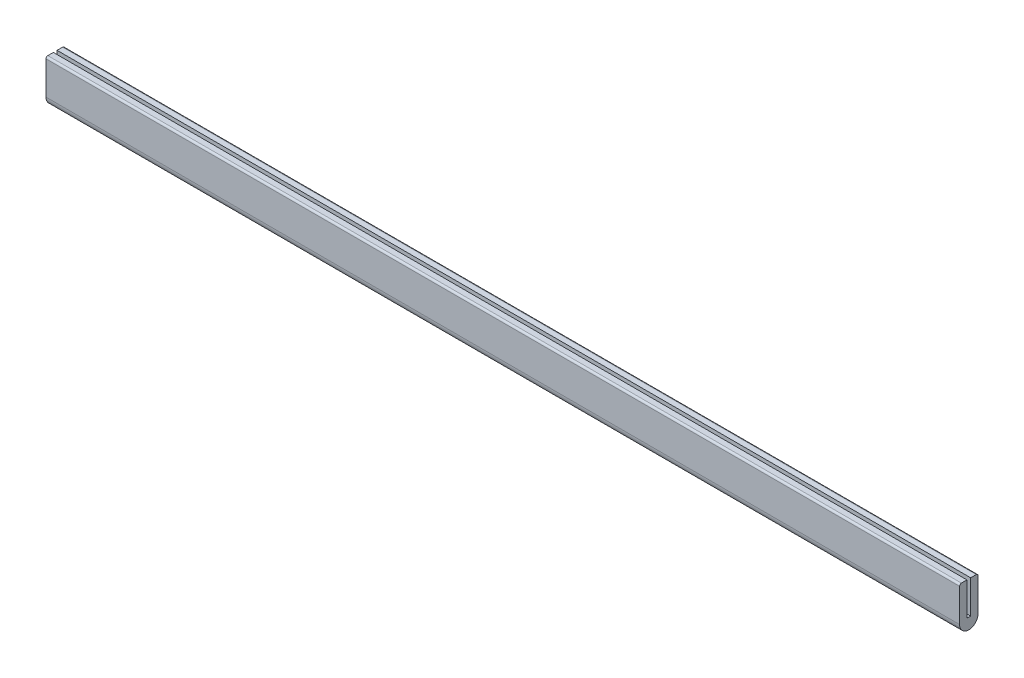
ISO-10303-21;
HEADER;
FILE_DESCRIPTION(('STEP AP214'),'2;1');
FILE_NAME('part.step','',(''),(''),'','','');
FILE_SCHEMA(('AUTOMOTIVE_DESIGN { 1 0 10303 214 1 1 1 1 }'));
ENDSEC;
DATA;
#1=APPLICATION_CONTEXT('core data for automotive mechanical design processes');
#2=APPLICATION_PROTOCOL_DEFINITION('international standard','automotive_design',2000,#1);
#3=PRODUCT_CONTEXT('',#1,'mechanical');
#4=PRODUCT('Part','Part','',(#3));
#5=PRODUCT_RELATED_PRODUCT_CATEGORY('part','',(#4));
#6=PRODUCT_DEFINITION_FORMATION('','',#4);
#7=PRODUCT_DEFINITION_CONTEXT('part definition',#1,'design');
#8=PRODUCT_DEFINITION('design','',#6,#7);
#9=PRODUCT_DEFINITION_SHAPE('','',#8);
#10=(LENGTH_UNIT() NAMED_UNIT(*) SI_UNIT(.MILLI.,.METRE.));
#11=(NAMED_UNIT(*) PLANE_ANGLE_UNIT() SI_UNIT($,.RADIAN.));
#12=(NAMED_UNIT(*) SI_UNIT($,.STERADIAN.) SOLID_ANGLE_UNIT());
#13=UNCERTAINTY_MEASURE_WITH_UNIT(LENGTH_MEASURE(1.E-05),#10,'distance_accuracy_value','');
#14=(GEOMETRIC_REPRESENTATION_CONTEXT(3) GLOBAL_UNCERTAINTY_ASSIGNED_CONTEXT((#13)) GLOBAL_UNIT_ASSIGNED_CONTEXT((#10,
#11,#12)) REPRESENTATION_CONTEXT('',''));
#15=CARTESIAN_POINT('',(0.,0.,0.));
#16=DIRECTION('',(0.,0.,1.));
#17=DIRECTION('',(1.,0.,0.));
#18=AXIS2_PLACEMENT_3D('',#15,#16,#17);
#19=CARTESIAN_POINT('',(393.7,28.575,1.5875));
#20=DIRECTION('',(0.,0.,1.));
#21=DIRECTION('',(0.,-1.,0.));
#22=AXIS2_PLACEMENT_3D('',#19,#20,#21);
#23=PLANE('',#22);
#24=DIRECTION('',(0.,1.,0.));
#25=VECTOR('',#24,1.);
#26=CARTESIAN_POINT('',(-393.7,28.575,1.5875));
#27=LINE('',#26,#25);
#28=CARTESIAN_POINT('',(-393.7,0.,1.5875));
#29=VERTEX_POINT('',#28);
#30=CARTESIAN_POINT('',(-393.7,28.575,1.5875));
#31=VERTEX_POINT('',#30);
#32=EDGE_CURVE('E132',#29,#31,#27,.T.);
#33=ORIENTED_EDGE('',*,*,#32,.T.);
#34=DIRECTION('',(-1.,0.,0.));
#35=VECTOR('',#34,1.);
#36=CARTESIAN_POINT('',(393.7,28.575,1.5875));
#37=LINE('',#36,#35);
#38=CARTESIAN_POINT('',(393.7,28.575,1.5875));
#39=VERTEX_POINT('',#38);
#40=EDGE_CURVE('E114',#39,#31,#37,.T.);
#41=ORIENTED_EDGE('',*,*,#40,.F.);
#42=DIRECTION('',(0.,1.,0.));
#43=VECTOR('',#42,1.);
#44=CARTESIAN_POINT('',(393.7,28.575,1.5875));
#45=LINE('',#44,#43);
#46=CARTESIAN_POINT('',(393.7,0.,1.5875));
#47=VERTEX_POINT('',#46);
#48=EDGE_CURVE('E120',#47,#39,#45,.T.);
#49=ORIENTED_EDGE('',*,*,#48,.F.);
#50=DIRECTION('',(-1.,0.,0.));
#51=VECTOR('',#50,1.);
#52=CARTESIAN_POINT('',(393.7,0.,1.5875));
#53=LINE('',#52,#51);
#54=EDGE_CURVE('E175',#47,#29,#53,.T.);
#55=ORIENTED_EDGE('',*,*,#54,.T.);
#56=EDGE_LOOP('',(#33,#41,#49,#55));
#57=FACE_BOUND('',#56,.T.);
#58=ADVANCED_FACE('F32',(#57),#23,.F.);
#59=CARTESIAN_POINT('',(393.7,28.575,1.5875));
#60=DIRECTION('',(0.,-1.,0.));
#61=DIRECTION('',(0.,0.,-1.));
#62=AXIS2_PLACEMENT_3D('',#59,#60,#61);
#63=PLANE('',#62);
#64=DIRECTION('',(0.,0.,1.));
#65=VECTOR('',#64,1.);
#66=CARTESIAN_POINT('',(-393.7,28.575,1.5875));
#67=LINE('',#66,#65);
#68=CARTESIAN_POINT('',(-393.7,28.575,6.34999999999999));
#69=VERTEX_POINT('',#68);
#70=EDGE_CURVE('E189',#31,#69,#67,.T.);
#71=ORIENTED_EDGE('',*,*,#70,.T.);
#72=DIRECTION('',(-1.,0.,0.));
#73=VECTOR('',#72,1.);
#74=CARTESIAN_POINT('',(393.7,28.575,6.34999999999999));
#75=LINE('',#74,#73);
#76=CARTESIAN_POINT('',(393.7,28.575,6.34999999999999));
#77=VERTEX_POINT('',#76);
#78=EDGE_CURVE('E117',#69,#77,#75,.F.);
#79=ORIENTED_EDGE('',*,*,#78,.T.);
#80=DIRECTION('',(0.,0.,1.));
#81=VECTOR('',#80,1.);
#82=CARTESIAN_POINT('',(393.7,28.575,1.5875));
#83=LINE('',#82,#81);
#84=EDGE_CURVE('E109',#39,#77,#83,.T.);
#85=ORIENTED_EDGE('',*,*,#84,.F.);
#86=ORIENTED_EDGE('',*,*,#40,.T.);
#87=EDGE_LOOP('',(#71,#79,#85,#86));
#88=FACE_BOUND('',#87,.T.);
#89=ADVANCED_FACE('F112',(#88),#63,.F.);
#90=CARTESIAN_POINT('',(393.7,28.575,7.93749999999999));
#91=DIRECTION('',(0.,0.,-1.));
#92=DIRECTION('',(0.,1.,0.));
#93=AXIS2_PLACEMENT_3D('',#90,#91,#92);
#94=PLANE('',#93);
#95=DIRECTION('',(0.,-1.,0.));
#96=VECTOR('',#95,1.);
#97=CARTESIAN_POINT('',(393.7,28.575,7.93749999999999));
#98=LINE('',#97,#96);
#99=CARTESIAN_POINT('',(393.7,26.9875,7.93749999999999));
#100=VERTEX_POINT('',#99);
#101=CARTESIAN_POINT('',(393.7,-1.58750000000001,7.9375));
#102=VERTEX_POINT('',#101);
#103=EDGE_CURVE('E119',#100,#102,#98,.T.);
#104=ORIENTED_EDGE('',*,*,#103,.F.);
#105=DIRECTION('',(-1.,0.,0.));
#106=VECTOR('',#105,1.);
#107=CARTESIAN_POINT('',(393.7,26.9875,7.93749999999999));
#108=LINE('',#107,#106);
#109=CARTESIAN_POINT('',(-393.7,26.9875,7.93749999999999));
#110=VERTEX_POINT('',#109);
#111=EDGE_CURVE('E133',#100,#110,#108,.T.);
#112=ORIENTED_EDGE('',*,*,#111,.T.);
#113=DIRECTION('',(0.,-1.,0.));
#114=VECTOR('',#113,1.);
#115=CARTESIAN_POINT('',(-393.7,28.575,7.93749999999999));
#116=LINE('',#115,#114);
#117=CARTESIAN_POINT('',(-393.7,-1.58750000000001,7.9375));
#118=VERTEX_POINT('',#117);
#119=EDGE_CURVE('E188',#110,#118,#116,.T.);
#120=ORIENTED_EDGE('',*,*,#119,.T.);
#121=DIRECTION('',(-1.,0.,0.));
#122=VECTOR('',#121,1.);
#123=CARTESIAN_POINT('',(393.7,-1.58750000000001,7.9375));
#124=LINE('',#123,#122);
#125=EDGE_CURVE('E134',#102,#118,#124,.T.);
#126=ORIENTED_EDGE('',*,*,#125,.F.);
#127=EDGE_LOOP('',(#104,#112,#120,#126));
#128=FACE_BOUND('',#127,.T.);
#129=ADVANCED_FACE('F205',(#128),#94,.F.);
#130=CARTESIAN_POINT('',(393.7,-1.58750000000001,0.));
#131=DIRECTION('',(-1.,0.,0.));
#132=DIRECTION('',(0.,0.,1.));
#133=AXIS2_PLACEMENT_3D('',#130,#131,#132);
#134=CYLINDRICAL_SURFACE('',#133,7.9375);
#135=CARTESIAN_POINT('',(-393.7,-1.58750000000001,0.));
#136=DIRECTION('',(1.,0.,0.));
#137=DIRECTION('',(0.,0.,1.));
#138=AXIS2_PLACEMENT_3D('',#135,#136,#137);
#139=CIRCLE('',#138,7.9375);
#140=CARTESIAN_POINT('',(-393.7,-1.5875,-7.9375));
#141=VERTEX_POINT('',#140);
#142=EDGE_CURVE('E170',#118,#141,#139,.T.);
#143=ORIENTED_EDGE('',*,*,#142,.T.);
#144=DIRECTION('',(-1.,0.,0.));
#145=VECTOR('',#144,1.);
#146=CARTESIAN_POINT('',(393.7,-1.5875,-7.9375));
#147=LINE('',#146,#145);
#148=CARTESIAN_POINT('',(393.7,-1.5875,-7.9375));
#149=VERTEX_POINT('',#148);
#150=EDGE_CURVE('E140',#149,#141,#147,.T.);
#151=ORIENTED_EDGE('',*,*,#150,.F.);
#152=CARTESIAN_POINT('',(393.7,-1.58750000000001,0.));
#153=DIRECTION('',(1.,0.,0.));
#154=DIRECTION('',(0.,0.,1.));
#155=AXIS2_PLACEMENT_3D('',#152,#153,#154);
#156=CIRCLE('',#155,7.9375);
#157=EDGE_CURVE('E199',#102,#149,#156,.T.);
#158=ORIENTED_EDGE('',*,*,#157,.F.);
#159=ORIENTED_EDGE('',*,*,#125,.T.);
#160=EDGE_LOOP('',(#143,#151,#158,#159));
#161=FACE_BOUND('',#160,.T.);
#162=ADVANCED_FACE('F206',(#161),#134,.T.);
#163=CARTESIAN_POINT('',(393.7,28.575,-7.93749999999999));
#164=DIRECTION('',(0.,0.,1.));
#165=DIRECTION('',(0.,-1.,0.));
#166=AXIS2_PLACEMENT_3D('',#163,#164,#165);
#167=PLANE('',#166);
#168=DIRECTION('',(0.,1.,0.));
#169=VECTOR('',#168,1.);
#170=CARTESIAN_POINT('',(-393.7,28.575,-7.93749999999999));
#171=LINE('',#170,#169);
#172=CARTESIAN_POINT('',(-393.7,26.9875,-7.93749999999999));
#173=VERTEX_POINT('',#172);
#174=EDGE_CURVE('E167',#141,#173,#171,.T.);
#175=ORIENTED_EDGE('',*,*,#174,.T.);
#176=DIRECTION('',(-1.,0.,0.));
#177=VECTOR('',#176,1.);
#178=CARTESIAN_POINT('',(393.7,26.9875,-7.93749999999999));
#179=LINE('',#178,#177);
#180=CARTESIAN_POINT('',(393.7,26.9875,-7.93749999999999));
#181=VERTEX_POINT('',#180);
#182=EDGE_CURVE('E11',#173,#181,#179,.F.);
#183=ORIENTED_EDGE('',*,*,#182,.T.);
#184=DIRECTION('',(0.,1.,0.));
#185=VECTOR('',#184,1.);
#186=CARTESIAN_POINT('',(393.7,28.575,-7.93749999999999));
#187=LINE('',#186,#185);
#188=EDGE_CURVE('E184',#149,#181,#187,.T.);
#189=ORIENTED_EDGE('',*,*,#188,.F.);
#190=ORIENTED_EDGE('',*,*,#150,.T.);
#191=EDGE_LOOP('',(#175,#183,#189,#190));
#192=FACE_BOUND('',#191,.T.);
#193=ADVANCED_FACE('F183',(#192),#167,.F.);
#194=CARTESIAN_POINT('',(393.7,28.575,-7.93749999999999));
#195=DIRECTION('',(0.,-1.,0.));
#196=DIRECTION('',(0.,0.,-1.));
#197=AXIS2_PLACEMENT_3D('',#194,#195,#196);
#198=PLANE('',#197);
#199=DIRECTION('',(0.,0.,1.));
#200=VECTOR('',#199,1.);
#201=CARTESIAN_POINT('',(393.7,28.575,-7.93749999999999));
#202=LINE('',#201,#200);
#203=CARTESIAN_POINT('',(393.7,28.575,-6.34999999999999));
#204=VERTEX_POINT('',#203);
#205=CARTESIAN_POINT('',(393.7,28.575,-1.58749999999999));
#206=VERTEX_POINT('',#205);
#207=EDGE_CURVE('E158',#204,#206,#202,.T.);
#208=ORIENTED_EDGE('',*,*,#207,.F.);
#209=DIRECTION('',(-1.,0.,0.));
#210=VECTOR('',#209,1.);
#211=CARTESIAN_POINT('',(393.7,28.575,-6.34999999999999));
#212=LINE('',#211,#210);
#213=CARTESIAN_POINT('',(-393.7,28.575,-6.34999999999999));
#214=VERTEX_POINT('',#213);
#215=EDGE_CURVE('E40',#204,#214,#212,.T.);
#216=ORIENTED_EDGE('',*,*,#215,.T.);
#217=DIRECTION('',(0.,0.,1.));
#218=VECTOR('',#217,1.);
#219=CARTESIAN_POINT('',(-393.7,28.575,-7.93749999999999));
#220=LINE('',#219,#218);
#221=CARTESIAN_POINT('',(-393.7,28.575,-1.58749999999999));
#222=VERTEX_POINT('',#221);
#223=EDGE_CURVE('E156',#214,#222,#220,.T.);
#224=ORIENTED_EDGE('',*,*,#223,.T.);
#225=DIRECTION('',(-1.,0.,0.));
#226=VECTOR('',#225,1.);
#227=CARTESIAN_POINT('',(393.7,28.575,-1.58749999999999));
#228=LINE('',#227,#226);
#229=EDGE_CURVE('E180',#206,#222,#228,.T.);
#230=ORIENTED_EDGE('',*,*,#229,.F.);
#231=EDGE_LOOP('',(#208,#216,#224,#230));
#232=FACE_BOUND('',#231,.T.);
#233=ADVANCED_FACE('F154',(#232),#198,.F.);
#234=CARTESIAN_POINT('',(393.7,28.575,-1.58749999999999));
#235=DIRECTION('',(0.,0.,-1.));
#236=DIRECTION('',(0.,1.,0.));
#237=AXIS2_PLACEMENT_3D('',#234,#235,#236);
#238=PLANE('',#237);
#239=DIRECTION('',(0.,-1.,0.));
#240=VECTOR('',#239,1.);
#241=CARTESIAN_POINT('',(-393.7,28.575,-1.58749999999999));
#242=LINE('',#241,#240);
#243=CARTESIAN_POINT('',(-393.7,0.,-1.5875));
#244=VERTEX_POINT('',#243);
#245=EDGE_CURVE('E166',#222,#244,#242,.T.);
#246=ORIENTED_EDGE('',*,*,#245,.T.);
#247=DIRECTION('',(-1.,0.,0.));
#248=VECTOR('',#247,1.);
#249=CARTESIAN_POINT('',(393.7,0.,-1.5875));
#250=LINE('',#249,#248);
#251=CARTESIAN_POINT('',(393.7,0.,-1.5875));
#252=VERTEX_POINT('',#251);
#253=EDGE_CURVE('E177',#252,#244,#250,.T.);
#254=ORIENTED_EDGE('',*,*,#253,.F.);
#255=DIRECTION('',(0.,-1.,0.));
#256=VECTOR('',#255,1.);
#257=CARTESIAN_POINT('',(393.7,28.575,-1.58749999999999));
#258=LINE('',#257,#256);
#259=EDGE_CURVE('E195',#206,#252,#258,.T.);
#260=ORIENTED_EDGE('',*,*,#259,.F.);
#261=ORIENTED_EDGE('',*,*,#229,.T.);
#262=EDGE_LOOP('',(#246,#254,#260,#261));
#263=FACE_BOUND('',#262,.T.);
#264=ADVANCED_FACE('F234',(#263),#238,.F.);
#265=CARTESIAN_POINT('',(393.7,0.,1.5875));
#266=DIRECTION('',(0.,-1.,0.));
#267=DIRECTION('',(0.,0.,-1.));
#268=AXIS2_PLACEMENT_3D('',#265,#266,#267);
#269=PLANE('',#268);
#270=DIRECTION('',(0.,0.,1.));
#271=VECTOR('',#270,1.);
#272=CARTESIAN_POINT('',(-393.7,0.,1.5875));
#273=LINE('',#272,#271);
#274=EDGE_CURVE('E129',#244,#29,#273,.T.);
#275=ORIENTED_EDGE('',*,*,#274,.T.);
#276=ORIENTED_EDGE('',*,*,#54,.F.);
#277=DIRECTION('',(0.,0.,1.));
#278=VECTOR('',#277,1.);
#279=CARTESIAN_POINT('',(393.7,0.,1.5875));
#280=LINE('',#279,#278);
#281=EDGE_CURVE('E125',#252,#47,#280,.T.);
#282=ORIENTED_EDGE('',*,*,#281,.F.);
#283=ORIENTED_EDGE('',*,*,#253,.T.);
#284=EDGE_LOOP('',(#275,#276,#282,#283));
#285=FACE_BOUND('',#284,.T.);
#286=ADVANCED_FACE('F230',(#285),#269,.F.);
#287=CARTESIAN_POINT('',(393.7,-1.58750000000001,0.));
#288=DIRECTION('',(-1.,0.,0.));
#289=DIRECTION('',(0.,0.,1.));
#290=AXIS2_PLACEMENT_3D('',#287,#288,#289);
#291=PLANE('',#290);
#292=ORIENTED_EDGE('',*,*,#84,.T.);
#293=CARTESIAN_POINT('',(393.7,26.9875,6.34999999999999));
#294=DIRECTION('',(-1.,0.,0.));
#295=DIRECTION('',(0.,0.,1.));
#296=AXIS2_PLACEMENT_3D('',#293,#294,#295);
#297=CIRCLE('',#296,1.5875);
#298=EDGE_CURVE('E149',#77,#100,#297,.F.);
#299=ORIENTED_EDGE('',*,*,#298,.T.);
#300=ORIENTED_EDGE('',*,*,#103,.T.);
#301=ORIENTED_EDGE('',*,*,#157,.T.);
#302=ORIENTED_EDGE('',*,*,#188,.T.);
#303=CARTESIAN_POINT('',(393.7,26.9875,-6.34999999999999));
#304=DIRECTION('',(-1.,0.,0.));
#305=DIRECTION('',(0.,0.,1.));
#306=AXIS2_PLACEMENT_3D('',#303,#304,#305);
#307=CIRCLE('',#306,1.5875);
#308=EDGE_CURVE('E47',#181,#204,#307,.F.);
#309=ORIENTED_EDGE('',*,*,#308,.T.);
#310=ORIENTED_EDGE('',*,*,#207,.T.);
#311=ORIENTED_EDGE('',*,*,#259,.T.);
#312=ORIENTED_EDGE('',*,*,#281,.T.);
#313=ORIENTED_EDGE('',*,*,#48,.T.);
#314=EDGE_LOOP('',(#292,#299,#300,#301,#302,#309,#310,#311,#312,#313));
#315=FACE_BOUND('',#314,.T.);
#316=ADVANCED_FACE('F123',(#315),#291,.F.);
#317=CARTESIAN_POINT('',(-393.7,-1.58750000000001,0.));
#318=DIRECTION('',(-1.,0.,0.));
#319=DIRECTION('',(0.,0.,1.));
#320=AXIS2_PLACEMENT_3D('',#317,#318,#319);
#321=PLANE('',#320);
#322=ORIENTED_EDGE('',*,*,#119,.F.);
#323=CARTESIAN_POINT('',(-393.7,26.9875,6.34999999999999));
#324=DIRECTION('',(-1.,0.,0.));
#325=DIRECTION('',(0.,0.,1.));
#326=AXIS2_PLACEMENT_3D('',#323,#324,#325);
#327=CIRCLE('',#326,1.5875);
#328=EDGE_CURVE('E145',#110,#69,#327,.T.);
#329=ORIENTED_EDGE('',*,*,#328,.T.);
#330=ORIENTED_EDGE('',*,*,#70,.F.);
#331=ORIENTED_EDGE('',*,*,#32,.F.);
#332=ORIENTED_EDGE('',*,*,#274,.F.);
#333=ORIENTED_EDGE('',*,*,#245,.F.);
#334=ORIENTED_EDGE('',*,*,#223,.F.);
#335=CARTESIAN_POINT('',(-393.7,26.9875,-6.34999999999999));
#336=DIRECTION('',(-1.,0.,0.));
#337=DIRECTION('',(0.,0.,1.));
#338=AXIS2_PLACEMENT_3D('',#335,#336,#337);
#339=CIRCLE('',#338,1.5875);
#340=EDGE_CURVE('E137',#214,#173,#339,.T.);
#341=ORIENTED_EDGE('',*,*,#340,.T.);
#342=ORIENTED_EDGE('',*,*,#174,.F.);
#343=ORIENTED_EDGE('',*,*,#142,.F.);
#344=EDGE_LOOP('',(#322,#329,#330,#331,#332,#333,#334,#341,#342,#343));
#345=FACE_BOUND('',#344,.T.);
#346=ADVANCED_FACE('F163',(#345),#321,.T.);
#347=CARTESIAN_POINT('',(393.7,26.9875,6.34999999999999));
#348=DIRECTION('',(-1.,0.,0.));
#349=DIRECTION('',(0.,0.,1.));
#350=AXIS2_PLACEMENT_3D('',#347,#348,#349);
#351=CYLINDRICAL_SURFACE('',#350,1.5875);
#352=ORIENTED_EDGE('',*,*,#298,.F.);
#353=ORIENTED_EDGE('',*,*,#78,.F.);
#354=ORIENTED_EDGE('',*,*,#328,.F.);
#355=ORIENTED_EDGE('',*,*,#111,.F.);
#356=EDGE_LOOP('',(#352,#353,#354,#355));
#357=FACE_BOUND('',#356,.T.);
#358=ADVANCED_FACE('F221',(#357),#351,.T.);
#359=CARTESIAN_POINT('',(393.7,26.9875,-6.34999999999999));
#360=DIRECTION('',(-1.,0.,0.));
#361=DIRECTION('',(0.,0.,1.));
#362=AXIS2_PLACEMENT_3D('',#359,#360,#361);
#363=CYLINDRICAL_SURFACE('',#362,1.5875);
#364=ORIENTED_EDGE('',*,*,#308,.F.);
#365=ORIENTED_EDGE('',*,*,#182,.F.);
#366=ORIENTED_EDGE('',*,*,#340,.F.);
#367=ORIENTED_EDGE('',*,*,#215,.F.);
#368=EDGE_LOOP('',(#364,#365,#366,#367));
#369=FACE_BOUND('',#368,.T.);
#370=ADVANCED_FACE('F34',(#369),#363,.T.);
#371=CLOSED_SHELL('',(#58,#89,#129,#162,#193,#233,#264,#286,#316,#346,#358,#370));
#372=MANIFOLD_SOLID_BREP('B2',#371);
#373=ADVANCED_BREP_SHAPE_REPRESENTATION('',(#18,#372),#14);
#374=SHAPE_DEFINITION_REPRESENTATION(#9,#373);
ENDSEC;
END-ISO-10303-21;
